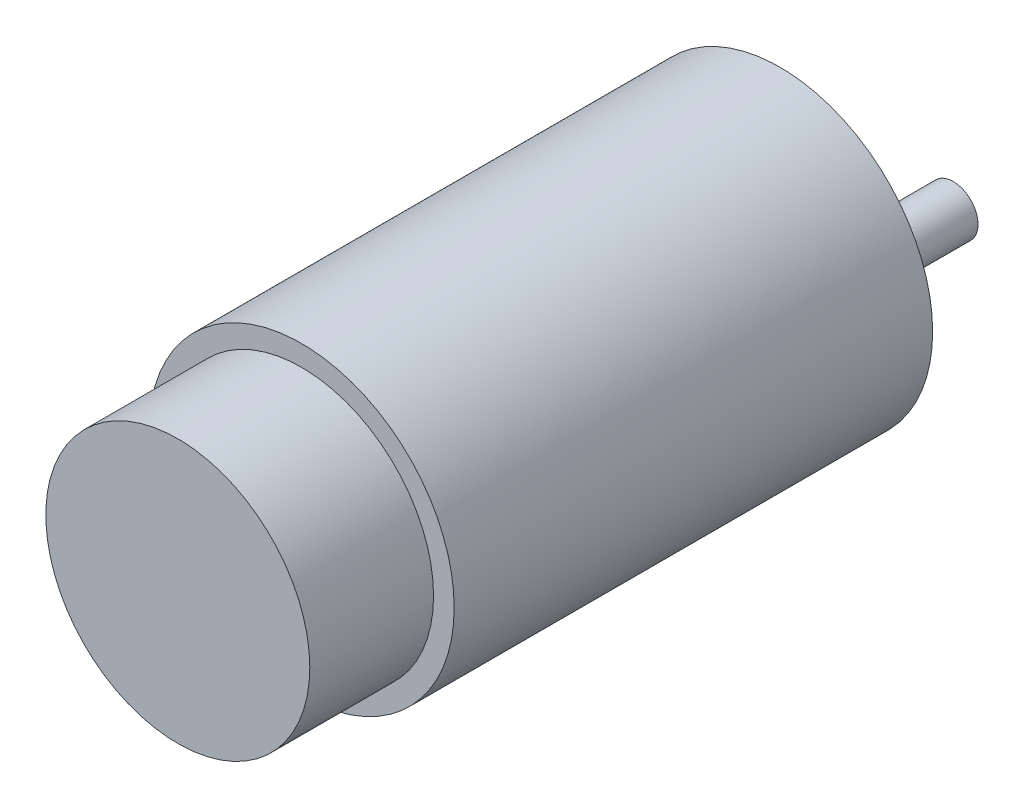
ISO-10303-21;
HEADER;
FILE_DESCRIPTION(('STEP AP214'),'2;1');
FILE_NAME('part.step','',(''),(''),'','','');
FILE_SCHEMA(('AUTOMOTIVE_DESIGN { 1 0 10303 214 1 1 1 1 }'));
ENDSEC;
DATA;
#1=APPLICATION_CONTEXT('core data for automotive mechanical design processes');
#2=APPLICATION_PROTOCOL_DEFINITION('international standard','automotive_design',2000,#1);
#3=PRODUCT_CONTEXT('',#1,'mechanical');
#4=PRODUCT('Part','Part','',(#3));
#5=PRODUCT_RELATED_PRODUCT_CATEGORY('part','',(#4));
#6=PRODUCT_DEFINITION_FORMATION('','',#4);
#7=PRODUCT_DEFINITION_CONTEXT('part definition',#1,'design');
#8=PRODUCT_DEFINITION('design','',#6,#7);
#9=PRODUCT_DEFINITION_SHAPE('','',#8);
#10=(LENGTH_UNIT() NAMED_UNIT(*) SI_UNIT(.MILLI.,.METRE.));
#11=(NAMED_UNIT(*) PLANE_ANGLE_UNIT() SI_UNIT($,.RADIAN.));
#12=(NAMED_UNIT(*) SI_UNIT($,.STERADIAN.) SOLID_ANGLE_UNIT());
#13=UNCERTAINTY_MEASURE_WITH_UNIT(LENGTH_MEASURE(1.E-05),#10,'distance_accuracy_value','');
#14=(GEOMETRIC_REPRESENTATION_CONTEXT(3) GLOBAL_UNCERTAINTY_ASSIGNED_CONTEXT((#13)) GLOBAL_UNIT_ASSIGNED_CONTEXT((#10,
#11,#12)) REPRESENTATION_CONTEXT('',''));
#15=CARTESIAN_POINT('',(0.,0.,0.));
#16=DIRECTION('',(0.,0.,1.));
#17=DIRECTION('',(1.,0.,0.));
#18=AXIS2_PLACEMENT_3D('',#15,#16,#17);
#19=CARTESIAN_POINT('',(0.,0.,73.));
#20=DIRECTION('',(0.,0.,-1.));
#21=DIRECTION('',(-1.,0.,0.));
#22=AXIS2_PLACEMENT_3D('',#19,#20,#21);
#23=CYLINDRICAL_SURFACE('',#22,16.);
#24=CARTESIAN_POINT('',(0.,0.,73.));
#25=DIRECTION('',(0.,0.,1.));
#26=DIRECTION('',(1.,0.,0.));
#27=AXIS2_PLACEMENT_3D('',#24,#25,#26);
#28=CIRCLE('',#27,16.);
#29=CARTESIAN_POINT('',(16.,0.,73.));
#30=VERTEX_POINT('',#29);
#31=EDGE_CURVE('E11',#30,#30,#28,.T.);
#32=ORIENTED_EDGE('',*,*,#31,.F.);
#33=EDGE_LOOP('',(#32));
#34=FACE_BOUND('',#33,.T.);
#35=CARTESIAN_POINT('',(0.,0.,58.));
#36=DIRECTION('',(0.,0.,1.));
#37=DIRECTION('',(1.,0.,0.));
#38=AXIS2_PLACEMENT_3D('',#35,#36,#37);
#39=CIRCLE('',#38,16.);
#40=CARTESIAN_POINT('',(16.,0.,58.));
#41=VERTEX_POINT('',#40);
#42=EDGE_CURVE('E52',#41,#41,#39,.T.);
#43=ORIENTED_EDGE('',*,*,#42,.T.);
#44=EDGE_LOOP('',(#43));
#45=FACE_BOUND('',#44,.T.);
#46=ADVANCED_FACE('F49',(#34,#45),#23,.T.);
#47=CARTESIAN_POINT('',(0.,0.,73.));
#48=DIRECTION('',(0.,0.,1.));
#49=DIRECTION('',(1.,0.,0.));
#50=AXIS2_PLACEMENT_3D('',#47,#48,#49);
#51=PLANE('',#50);
#52=ORIENTED_EDGE('',*,*,#31,.T.);
#53=EDGE_LOOP('',(#52));
#54=FACE_BOUND('',#53,.T.);
#55=ADVANCED_FACE('F64',(#54),#51,.T.);
#56=CARTESIAN_POINT('',(0.,0.,58.));
#57=DIRECTION('',(0.,0.,1.));
#58=DIRECTION('',(1.,0.,0.));
#59=AXIS2_PLACEMENT_3D('',#56,#57,#58);
#60=PLANE('',#59);
#61=ORIENTED_EDGE('',*,*,#42,.F.);
#62=EDGE_LOOP('',(#61));
#63=FACE_BOUND('',#62,.T.);
#64=ADVANCED_FACE('F62',(#63),#60,.F.);
#65=CLOSED_SHELL('',(#46,#55,#64));
#66=MANIFOLD_SOLID_BREP('B2',#65);
#67=CARTESIAN_POINT('',(0.,-7.,-6.));
#68=DIRECTION('',(0.,0.,-1.));
#69=DIRECTION('',(-1.,0.,0.));
#70=AXIS2_PLACEMENT_3D('',#67,#68,#69);
#71=PLANE('',#70);
#72=CARTESIAN_POINT('',(0.,-7.,-6.));
#73=DIRECTION('',(0.,0.,-1.));
#74=DIRECTION('',(-1.,0.,0.));
#75=AXIS2_PLACEMENT_3D('',#72,#73,#74);
#76=CIRCLE('',#75,6.);
#77=CARTESIAN_POINT('',(-6.,-7.,-6.));
#78=VERTEX_POINT('',#77);
#79=EDGE_CURVE('E137',#78,#78,#76,.T.);
#80=ORIENTED_EDGE('',*,*,#79,.T.);
#81=EDGE_LOOP('',(#80));
#82=FACE_BOUND('',#81,.T.);
#83=CARTESIAN_POINT('',(0.,-7.,-6.));
#84=DIRECTION('',(0.,0.,-1.));
#85=DIRECTION('',(-1.,0.,0.));
#86=AXIS2_PLACEMENT_3D('',#83,#84,#85);
#87=CIRCLE('',#86,3.);
#88=CARTESIAN_POINT('',(-3.,-7.,-6.));
#89=VERTEX_POINT('',#88);
#90=EDGE_CURVE('E125',#89,#89,#87,.T.);
#91=ORIENTED_EDGE('',*,*,#90,.F.);
#92=EDGE_LOOP('',(#91));
#93=FACE_BOUND('',#92,.T.);
#94=ADVANCED_FACE('F90',(#82,#93),#71,.T.);
#95=CARTESIAN_POINT('',(0.,-9.4,-50.0721744282442));
#96=DIRECTION('',(0.,-1.,0.));
#97=DIRECTION('',(0.,0.,-1.));
#98=AXIS2_PLACEMENT_3D('',#95,#96,#97);
#99=PLANE('',#98);
#100=DIRECTION('',(0.,0.,1.));
#101=VECTOR('',#100,1.);
#102=CARTESIAN_POINT('',(1.8,-9.4,-50.0721744282442));
#103=LINE('',#102,#101);
#104=CARTESIAN_POINT('',(1.8,-9.4,-21.));
#105=VERTEX_POINT('',#104);
#106=CARTESIAN_POINT('',(1.8,-9.4,-9.));
#107=VERTEX_POINT('',#106);
#108=EDGE_CURVE('E123',#105,#107,#103,.T.);
#109=ORIENTED_EDGE('',*,*,#108,.T.);
#110=DIRECTION('',(-1.,0.,0.));
#111=VECTOR('',#110,1.);
#112=CARTESIAN_POINT('',(0.,-9.4,-9.));
#113=LINE('',#112,#111);
#114=CARTESIAN_POINT('',(-1.8,-9.4,-9.));
#115=VERTEX_POINT('',#114);
#116=EDGE_CURVE('E47',#107,#115,#113,.T.);
#117=ORIENTED_EDGE('',*,*,#116,.T.);
#118=DIRECTION('',(0.,0.,1.));
#119=VECTOR('',#118,1.);
#120=CARTESIAN_POINT('',(-1.8,-9.4,-50.0721744282442));
#121=LINE('',#120,#119);
#122=CARTESIAN_POINT('',(-1.8,-9.4,-21.));
#123=VERTEX_POINT('',#122);
#124=EDGE_CURVE('E124',#123,#115,#121,.T.);
#125=ORIENTED_EDGE('',*,*,#124,.F.);
#126=DIRECTION('',(-1.,0.,0.));
#127=VECTOR('',#126,1.);
#128=CARTESIAN_POINT('',(0.,-9.4,-21.));
#129=LINE('',#128,#127);
#130=EDGE_CURVE('E129',#105,#123,#129,.T.);
#131=ORIENTED_EDGE('',*,*,#130,.F.);
#132=EDGE_LOOP('',(#109,#117,#125,#131));
#133=FACE_BOUND('',#132,.T.);
#134=ADVANCED_FACE('F128',(#133),#99,.T.);
#135=CARTESIAN_POINT('',(0.,0.,58.));
#136=DIRECTION('',(0.,0.,-1.));
#137=DIRECTION('',(-1.,0.,0.));
#138=AXIS2_PLACEMENT_3D('',#135,#136,#137);
#139=CYLINDRICAL_SURFACE('',#138,18.5);
#140=CARTESIAN_POINT('',(0.,0.,58.));
#141=DIRECTION('',(0.,0.,1.));
#142=DIRECTION('',(1.,0.,0.));
#143=AXIS2_PLACEMENT_3D('',#140,#141,#142);
#144=CIRCLE('',#143,18.5);
#145=CARTESIAN_POINT('',(-18.5,0.,58.));
#146=VERTEX_POINT('',#145);
#147=EDGE_CURVE('E141',#146,#146,#144,.T.);
#148=CARTESIAN_POINT('',(0.,0.,0.));
#149=DIRECTION('',(0.,0.,1.));
#150=DIRECTION('',(1.,0.,0.));
#151=AXIS2_PLACEMENT_3D('',#148,#149,#150);
#152=CIRCLE('',#151,18.5);
#153=CARTESIAN_POINT('',(-18.5,0.,0.));
#154=VERTEX_POINT('',#153);
#155=EDGE_CURVE('E140',#154,#154,#152,.T.);
#156=CARTESIAN_POINT('',(-18.5,0.,58.));
#157=CARTESIAN_POINT('',(-18.5,0.,57.3958333333333));
#158=CARTESIAN_POINT('',(-18.5,0.,56.7916666666667));
#159=CARTESIAN_POINT('',(-18.5,0.,55.5833333333333));
#160=CARTESIAN_POINT('',(-18.5,0.,54.9791666666667));
#161=CARTESIAN_POINT('',(-18.5,0.,53.7708333333333));
#162=CARTESIAN_POINT('',(-18.5,0.,53.1666666666667));
#163=CARTESIAN_POINT('',(-18.5,0.,51.9583333333333));
#164=CARTESIAN_POINT('',(-18.5,0.,51.3541666666667));
#165=CARTESIAN_POINT('',(-18.5,0.,50.1458333333333));
#166=CARTESIAN_POINT('',(-18.5,0.,49.5416666666667));
#167=CARTESIAN_POINT('',(-18.5,0.,48.3333333333333));
#168=CARTESIAN_POINT('',(-18.5,0.,47.7291666666667));
#169=CARTESIAN_POINT('',(-18.5,0.,46.5208333333333));
#170=CARTESIAN_POINT('',(-18.5,0.,45.9166666666667));
#171=CARTESIAN_POINT('',(-18.5,0.,44.7083333333333));
#172=CARTESIAN_POINT('',(-18.5,0.,44.1041666666667));
#173=CARTESIAN_POINT('',(-18.5,0.,42.8958333333333));
#174=CARTESIAN_POINT('',(-18.5,0.,42.2916666666667));
#175=CARTESIAN_POINT('',(-18.5,0.,41.0833333333333));
#176=CARTESIAN_POINT('',(-18.5,0.,40.4791666666667));
#177=CARTESIAN_POINT('',(-18.5,0.,39.2708333333333));
#178=CARTESIAN_POINT('',(-18.5,0.,38.6666666666667));
#179=CARTESIAN_POINT('',(-18.5,0.,37.4583333333333));
#180=CARTESIAN_POINT('',(-18.5,0.,36.8541666666667));
#181=CARTESIAN_POINT('',(-18.5,0.,35.6458333333333));
#182=CARTESIAN_POINT('',(-18.5,0.,35.0416666666667));
#183=CARTESIAN_POINT('',(-18.5,0.,33.8333333333333));
#184=CARTESIAN_POINT('',(-18.5,0.,33.2291666666667));
#185=CARTESIAN_POINT('',(-18.5,0.,32.0208333333333));
#186=CARTESIAN_POINT('',(-18.5,0.,31.4166666666667));
#187=CARTESIAN_POINT('',(-18.5,0.,30.2083333333333));
#188=CARTESIAN_POINT('',(-18.5,0.,29.6041666666667));
#189=CARTESIAN_POINT('',(-18.5,0.,28.3958333333333));
#190=CARTESIAN_POINT('',(-18.5,0.,27.7916666666667));
#191=CARTESIAN_POINT('',(-18.5,0.,26.5833333333333));
#192=CARTESIAN_POINT('',(-18.5,0.,25.9791666666667));
#193=CARTESIAN_POINT('',(-18.5,0.,24.7708333333333));
#194=CARTESIAN_POINT('',(-18.5,0.,24.1666666666667));
#195=CARTESIAN_POINT('',(-18.5,0.,22.9583333333333));
#196=CARTESIAN_POINT('',(-18.5,0.,22.3541666666667));
#197=CARTESIAN_POINT('',(-18.5,0.,21.1458333333333));
#198=CARTESIAN_POINT('',(-18.5,0.,20.5416666666667));
#199=CARTESIAN_POINT('',(-18.5,0.,19.3333333333333));
#200=CARTESIAN_POINT('',(-18.5,0.,18.7291666666667));
#201=CARTESIAN_POINT('',(-18.5,0.,17.5208333333333));
#202=CARTESIAN_POINT('',(-18.5,0.,16.9166666666667));
#203=CARTESIAN_POINT('',(-18.5,0.,15.7083333333333));
#204=CARTESIAN_POINT('',(-18.5,0.,15.1041666666667));
#205=CARTESIAN_POINT('',(-18.5,0.,13.8958333333333));
#206=CARTESIAN_POINT('',(-18.5,0.,13.2916666666667));
#207=CARTESIAN_POINT('',(-18.5,0.,12.0833333333333));
#208=CARTESIAN_POINT('',(-18.5,0.,11.4791666666667));
#209=CARTESIAN_POINT('',(-18.5,0.,10.2708333333333));
#210=CARTESIAN_POINT('',(-18.5,0.,9.66666666666667));
#211=CARTESIAN_POINT('',(-18.5,0.,8.45833333333333));
#212=CARTESIAN_POINT('',(-18.5,0.,7.85416666666667));
#213=CARTESIAN_POINT('',(-18.5,0.,6.64583333333333));
#214=CARTESIAN_POINT('',(-18.5,0.,6.04166666666667));
#215=CARTESIAN_POINT('',(-18.5,0.,4.83333333333333));
#216=CARTESIAN_POINT('',(-18.5,0.,4.22916666666667));
#217=CARTESIAN_POINT('',(-18.5,0.,3.02083333333334));
#218=CARTESIAN_POINT('',(-18.5,0.,2.41666666666667));
#219=CARTESIAN_POINT('',(-18.5,0.,1.20833333333333));
#220=CARTESIAN_POINT('',(-18.5,0.,0.604166666666666));
#221=CARTESIAN_POINT('',(-18.5,0.,0.));
#222=B_SPLINE_CURVE_WITH_KNOTS('',3,(#156,#157,#158,#159,#160,#161,#162,#163,#164,#165,#166,
#167,#168,#169,#170,#171,#172,#173,#174,#175,#176,#177,#178,#179,#180,#181,#182,#183,#184,#185,
#186,#187,#188,#189,#190,#191,#192,#193,#194,#195,#196,#197,#198,#199,#200,#201,#202,#203,#204,
#205,#206,#207,#208,#209,#210,#211,#212,#213,#214,#215,#216,#217,#218,#219,#220,#221),
.UNSPECIFIED.,.F.,.F.,(4,2,2,2,2,2,2,2,2,2,2,2,2,2,2,2,2,2,2,2,2,2,2,2,2,2,2,2,2,2,2,2,4),(0.,
1.8125,3.625,5.4375,7.25000000000001,9.0625,10.875,12.6875,14.5,16.3125,18.125,19.9375,21.75,
23.5625,25.375,27.1875,29.,30.8125,32.625,34.4375,36.25,38.0625,39.875,41.6875,43.5,45.3125,
47.125,48.9375,50.75,52.5625,54.375,56.1875,58.),.UNSPECIFIED.);
#223=EDGE_CURVE('BSEAM92',#146,#154,#222,.T.);
#224=ORIENTED_EDGE('',*,*,#147,.F.);
#225=ORIENTED_EDGE('',*,*,#155,.T.);
#226=ORIENTED_EDGE('',*,*,#223,.T.);
#227=ORIENTED_EDGE('',*,*,#223,.F.);
#228=EDGE_LOOP('',(#224,#226,#225,#227));
#229=FACE_BOUND('',#228,.T.);
#230=ADVANCED_FACE('F92',(#229),#139,.T.);
#231=CARTESIAN_POINT('',(0.,0.,58.));
#232=DIRECTION('',(0.,0.,1.));
#233=DIRECTION('',(1.,0.,0.));
#234=AXIS2_PLACEMENT_3D('',#231,#232,#233);
#235=PLANE('',#234);
#236=ORIENTED_EDGE('',*,*,#147,.T.);
#237=EDGE_LOOP('',(#236));
#238=FACE_BOUND('',#237,.T.);
#239=ADVANCED_FACE('F153',(#238),#235,.T.);
#240=CARTESIAN_POINT('',(0.,0.,0.));
#241=DIRECTION('',(0.,0.,1.));
#242=DIRECTION('',(1.,0.,0.));
#243=AXIS2_PLACEMENT_3D('',#240,#241,#242);
#244=PLANE('',#243);
#245=CARTESIAN_POINT('',(-7.74999999999993,-13.4233937586588,0.));
#246=DIRECTION('',(0.,0.,-1.));
#247=DIRECTION('',(-1.,0.,0.));
#248=AXIS2_PLACEMENT_3D('',#245,#246,#247);
#249=CIRCLE('',#248,1.6);
#250=CARTESIAN_POINT('',(-9.34999999999993,-13.4233937586588,0.));
#251=VERTEX_POINT('',#250);
#252=EDGE_CURVE('E272',#251,#251,#249,.T.);
#253=ORIENTED_EDGE('',*,*,#252,.F.);
#254=EDGE_LOOP('',(#253));
#255=FACE_BOUND('',#254,.T.);
#256=CARTESIAN_POINT('',(-15.5,0.,0.));
#257=DIRECTION('',(0.,0.,-1.));
#258=DIRECTION('',(-1.,0.,0.));
#259=AXIS2_PLACEMENT_3D('',#256,#257,#258);
#260=CIRCLE('',#259,1.6);
#261=CARTESIAN_POINT('',(-17.1,0.,0.));
#262=VERTEX_POINT('',#261);
#263=EDGE_CURVE('E266',#262,#262,#260,.T.);
#264=ORIENTED_EDGE('',*,*,#263,.F.);
#265=EDGE_LOOP('',(#264));
#266=FACE_BOUND('',#265,.T.);
#267=CARTESIAN_POINT('',(-7.75000000000001,13.4233937586588,0.));
#268=DIRECTION('',(0.,0.,-1.));
#269=DIRECTION('',(-1.,0.,0.));
#270=AXIS2_PLACEMENT_3D('',#267,#268,#269);
#271=CIRCLE('',#270,1.6);
#272=CARTESIAN_POINT('',(-9.35000000000001,13.4233937586588,0.));
#273=VERTEX_POINT('',#272);
#274=EDGE_CURVE('E260',#273,#273,#271,.T.);
#275=ORIENTED_EDGE('',*,*,#274,.F.);
#276=EDGE_LOOP('',(#275));
#277=FACE_BOUND('',#276,.T.);
#278=CARTESIAN_POINT('',(7.75000000000002,13.4233937586588,0.));
#279=DIRECTION('',(0.,0.,-1.));
#280=DIRECTION('',(-1.,0.,0.));
#281=AXIS2_PLACEMENT_3D('',#278,#279,#280);
#282=CIRCLE('',#281,1.6);
#283=CARTESIAN_POINT('',(6.15000000000002,13.4233937586588,0.));
#284=VERTEX_POINT('',#283);
#285=EDGE_CURVE('E254',#284,#284,#282,.T.);
#286=ORIENTED_EDGE('',*,*,#285,.F.);
#287=EDGE_LOOP('',(#286));
#288=FACE_BOUND('',#287,.T.);
#289=CARTESIAN_POINT('',(15.5,0.,0.));
#290=DIRECTION('',(0.,0.,-1.));
#291=DIRECTION('',(-1.,0.,0.));
#292=AXIS2_PLACEMENT_3D('',#289,#290,#291);
#293=CIRCLE('',#292,1.6);
#294=CARTESIAN_POINT('',(13.9,0.,0.));
#295=VERTEX_POINT('',#294);
#296=EDGE_CURVE('E244',#295,#295,#293,.T.);
#297=ORIENTED_EDGE('',*,*,#296,.F.);
#298=EDGE_LOOP('',(#297));
#299=FACE_BOUND('',#298,.T.);
#300=CARTESIAN_POINT('',(7.74999999999988,-13.4233937586589,0.));
#301=DIRECTION('',(0.,0.,-1.));
#302=DIRECTION('',(-1.,0.,0.));
#303=AXIS2_PLACEMENT_3D('',#300,#301,#302);
#304=CIRCLE('',#303,1.59999999999997);
#305=CARTESIAN_POINT('',(6.14999999999991,-13.4233937586589,0.));
#306=VERTEX_POINT('',#305);
#307=EDGE_CURVE('E243',#306,#306,#304,.T.);
#308=ORIENTED_EDGE('',*,*,#307,.F.);
#309=EDGE_LOOP('',(#308));
#310=FACE_BOUND('',#309,.T.);
#311=CARTESIAN_POINT('',(0.,-7.,0.));
#312=DIRECTION('',(0.,0.,1.));
#313=DIRECTION('',(1.,0.,0.));
#314=AXIS2_PLACEMENT_3D('',#311,#312,#313);
#315=CIRCLE('',#314,6.);
#316=CARTESIAN_POINT('',(6.,-7.,0.));
#317=VERTEX_POINT('',#316);
#318=EDGE_CURVE('E98',#317,#317,#315,.F.);
#319=ORIENTED_EDGE('',*,*,#318,.F.);
#320=EDGE_LOOP('',(#319));
#321=FACE_BOUND('',#320,.T.);
#322=ORIENTED_EDGE('',*,*,#155,.F.);
#323=EDGE_LOOP('',(#322));
#324=FACE_BOUND('',#323,.T.);
#325=ADVANCED_FACE('F150',(#255,#266,#277,#288,#299,#310,#321,#324),#244,.F.);
#326=CARTESIAN_POINT('',(0.,-7.,-6.));
#327=DIRECTION('',(0.,0.,1.));
#328=DIRECTION('',(1.,0.,0.));
#329=AXIS2_PLACEMENT_3D('',#326,#327,#328);
#330=CYLINDRICAL_SURFACE('',#329,6.);
#331=ORIENTED_EDGE('',*,*,#79,.F.);
#332=EDGE_LOOP('',(#331));
#333=FACE_BOUND('',#332,.T.);
#334=ORIENTED_EDGE('',*,*,#318,.T.);
#335=EDGE_LOOP('',(#334));
#336=FACE_BOUND('',#335,.T.);
#337=ADVANCED_FACE('F148',(#333,#336),#330,.T.);
#338=CARTESIAN_POINT('',(0.,-7.,-50.0721744282442));
#339=DIRECTION('',(0.,0.,1.));
#340=DIRECTION('',(1.,0.,0.));
#341=AXIS2_PLACEMENT_3D('',#338,#339,#340);
#342=CYLINDRICAL_SURFACE('',#341,3.);
#343=ORIENTED_EDGE('',*,*,#90,.T.);
#344=EDGE_LOOP('',(#343));
#345=FACE_BOUND('',#344,.T.);
#346=CARTESIAN_POINT('',(0.,-7.,-9.));
#347=DIRECTION('',(0.,0.,1.));
#348=DIRECTION('',(1.,0.,0.));
#349=AXIS2_PLACEMENT_3D('',#346,#347,#348);
#350=CIRCLE('',#349,3.);
#351=EDGE_CURVE('E104',#115,#107,#350,.T.);
#352=ORIENTED_EDGE('',*,*,#351,.T.);
#353=ORIENTED_EDGE('',*,*,#108,.F.);
#354=CARTESIAN_POINT('',(0.,-7.,-21.));
#355=DIRECTION('',(0.,0.,1.));
#356=DIRECTION('',(1.,0.,0.));
#357=AXIS2_PLACEMENT_3D('',#354,#355,#356);
#358=CIRCLE('',#357,3.);
#359=EDGE_CURVE('E110',#105,#123,#358,.T.);
#360=ORIENTED_EDGE('',*,*,#359,.T.);
#361=ORIENTED_EDGE('',*,*,#124,.T.);
#362=EDGE_LOOP('',(#352,#353,#360,#361));
#363=FACE_BOUND('',#362,.T.);
#364=ADVANCED_FACE('F122',(#345,#363),#342,.T.);
#365=CARTESIAN_POINT('',(0.,0.,-21.));
#366=DIRECTION('',(0.,0.,1.));
#367=DIRECTION('',(1.,0.,0.));
#368=AXIS2_PLACEMENT_3D('',#365,#366,#367);
#369=PLANE('',#368);
#370=ORIENTED_EDGE('',*,*,#130,.T.);
#371=ORIENTED_EDGE('',*,*,#359,.F.);
#372=EDGE_LOOP('',(#370,#371));
#373=FACE_BOUND('',#372,.T.);
#374=ADVANCED_FACE('F181',(#373),#369,.F.);
#375=CARTESIAN_POINT('',(0.,0.,-9.));
#376=DIRECTION('',(0.,0.,1.));
#377=DIRECTION('',(1.,0.,0.));
#378=AXIS2_PLACEMENT_3D('',#375,#376,#377);
#379=PLANE('',#378);
#380=ORIENTED_EDGE('',*,*,#116,.F.);
#381=ORIENTED_EDGE('',*,*,#351,.F.);
#382=EDGE_LOOP('',(#380,#381));
#383=FACE_BOUND('',#382,.T.);
#384=ADVANCED_FACE('F115',(#383),#379,.F.);
#385=CARTESIAN_POINT('',(7.74999999999988,-13.4233937586589,5.));
#386=DIRECTION('',(0.,0.,-1.));
#387=DIRECTION('',(-1.,0.,0.));
#388=AXIS2_PLACEMENT_3D('',#385,#386,#387);
#389=CYLINDRICAL_SURFACE('',#388,1.59999999999997);
#390=CARTESIAN_POINT('',(7.74999999999988,-13.4233937586589,5.));
#391=DIRECTION('',(0.,0.,-1.));
#392=DIRECTION('',(-1.,0.,0.));
#393=AXIS2_PLACEMENT_3D('',#390,#391,#392);
#394=CIRCLE('',#393,1.59999999999997);
#395=CARTESIAN_POINT('',(6.14999999999991,-13.4233937586589,5.));
#396=VERTEX_POINT('',#395);
#397=EDGE_CURVE('E126',#396,#396,#394,.T.);
#398=ORIENTED_EDGE('',*,*,#397,.F.);
#399=EDGE_LOOP('',(#398));
#400=FACE_BOUND('',#399,.T.);
#401=ORIENTED_EDGE('',*,*,#307,.T.);
#402=EDGE_LOOP('',(#401));
#403=FACE_BOUND('',#402,.T.);
#404=ADVANCED_FACE('F191',(#400,#403),#389,.F.);
#405=CARTESIAN_POINT('',(7.74999999999988,-13.4233937586589,5.));
#406=DIRECTION('',(0.,0.,-1.));
#407=DIRECTION('',(-1.,0.,0.));
#408=AXIS2_PLACEMENT_3D('',#405,#406,#407);
#409=PLANE('',#408);
#410=ORIENTED_EDGE('',*,*,#397,.T.);
#411=EDGE_LOOP('',(#410));
#412=FACE_BOUND('',#411,.T.);
#413=ADVANCED_FACE('F194',(#412),#409,.T.);
#414=CARTESIAN_POINT('',(15.5,0.,5.));
#415=DIRECTION('',(0.,0.,-1.));
#416=DIRECTION('',(-1.,0.,0.));
#417=AXIS2_PLACEMENT_3D('',#414,#415,#416);
#418=CYLINDRICAL_SURFACE('',#417,1.6);
#419=CARTESIAN_POINT('',(15.5,0.,5.));
#420=DIRECTION('',(0.,0.,-1.));
#421=DIRECTION('',(-1.,0.,0.));
#422=AXIS2_PLACEMENT_3D('',#419,#420,#421);
#423=CIRCLE('',#422,1.6);
#424=CARTESIAN_POINT('',(13.9,0.,5.));
#425=VERTEX_POINT('',#424);
#426=EDGE_CURVE('E242',#425,#425,#423,.T.);
#427=ORIENTED_EDGE('',*,*,#426,.F.);
#428=EDGE_LOOP('',(#427));
#429=FACE_BOUND('',#428,.T.);
#430=ORIENTED_EDGE('',*,*,#296,.T.);
#431=EDGE_LOOP('',(#430));
#432=FACE_BOUND('',#431,.T.);
#433=ADVANCED_FACE('F198',(#429,#432),#418,.F.);
#434=CARTESIAN_POINT('',(15.5,0.,5.));
#435=DIRECTION('',(0.,0.,-1.));
#436=DIRECTION('',(-1.,0.,0.));
#437=AXIS2_PLACEMENT_3D('',#434,#435,#436);
#438=PLANE('',#437);
#439=ORIENTED_EDGE('',*,*,#426,.T.);
#440=EDGE_LOOP('',(#439));
#441=FACE_BOUND('',#440,.T.);
#442=ADVANCED_FACE('F228',(#441),#438,.T.);
#443=CARTESIAN_POINT('',(7.75000000000002,13.4233937586588,5.));
#444=DIRECTION('',(0.,0.,-1.));
#445=DIRECTION('',(-1.,0.,0.));
#446=AXIS2_PLACEMENT_3D('',#443,#444,#445);
#447=CYLINDRICAL_SURFACE('',#446,1.6);
#448=CARTESIAN_POINT('',(7.75000000000002,13.4233937586588,5.));
#449=DIRECTION('',(0.,0.,-1.));
#450=DIRECTION('',(-1.,0.,0.));
#451=AXIS2_PLACEMENT_3D('',#448,#449,#450);
#452=CIRCLE('',#451,1.6);
#453=CARTESIAN_POINT('',(6.15000000000002,13.4233937586588,5.));
#454=VERTEX_POINT('',#453);
#455=EDGE_CURVE('E249',#454,#454,#452,.T.);
#456=ORIENTED_EDGE('',*,*,#455,.F.);
#457=EDGE_LOOP('',(#456));
#458=FACE_BOUND('',#457,.T.);
#459=ORIENTED_EDGE('',*,*,#285,.T.);
#460=EDGE_LOOP('',(#459));
#461=FACE_BOUND('',#460,.T.);
#462=ADVANCED_FACE('F225',(#458,#461),#447,.F.);
#463=CARTESIAN_POINT('',(7.75000000000002,13.4233937586588,5.));
#464=DIRECTION('',(0.,0.,-1.));
#465=DIRECTION('',(-1.,0.,0.));
#466=AXIS2_PLACEMENT_3D('',#463,#464,#465);
#467=PLANE('',#466);
#468=ORIENTED_EDGE('',*,*,#455,.T.);
#469=EDGE_LOOP('',(#468));
#470=FACE_BOUND('',#469,.T.);
#471=ADVANCED_FACE('F220',(#470),#467,.T.);
#472=CARTESIAN_POINT('',(-7.75000000000001,13.4233937586588,5.));
#473=DIRECTION('',(0.,0.,-1.));
#474=DIRECTION('',(-1.,0.,0.));
#475=AXIS2_PLACEMENT_3D('',#472,#473,#474);
#476=CYLINDRICAL_SURFACE('',#475,1.6);
#477=CARTESIAN_POINT('',(-7.75000000000001,13.4233937586588,5.));
#478=DIRECTION('',(0.,0.,-1.));
#479=DIRECTION('',(-1.,0.,0.));
#480=AXIS2_PLACEMENT_3D('',#477,#478,#479);
#481=CIRCLE('',#480,1.6);
#482=CARTESIAN_POINT('',(-9.35000000000001,13.4233937586588,5.));
#483=VERTEX_POINT('',#482);
#484=EDGE_CURVE('E257',#483,#483,#481,.T.);
#485=ORIENTED_EDGE('',*,*,#484,.F.);
#486=EDGE_LOOP('',(#485));
#487=FACE_BOUND('',#486,.T.);
#488=ORIENTED_EDGE('',*,*,#274,.T.);
#489=EDGE_LOOP('',(#488));
#490=FACE_BOUND('',#489,.T.);
#491=ADVANCED_FACE('F217',(#487,#490),#476,.F.);
#492=CARTESIAN_POINT('',(-7.75000000000001,13.4233937586588,5.));
#493=DIRECTION('',(0.,0.,-1.));
#494=DIRECTION('',(-1.,0.,0.));
#495=AXIS2_PLACEMENT_3D('',#492,#493,#494);
#496=PLANE('',#495);
#497=ORIENTED_EDGE('',*,*,#484,.T.);
#498=EDGE_LOOP('',(#497));
#499=FACE_BOUND('',#498,.T.);
#500=ADVANCED_FACE('F212',(#499),#496,.T.);
#501=CARTESIAN_POINT('',(-15.5,0.,5.));
#502=DIRECTION('',(0.,0.,-1.));
#503=DIRECTION('',(-1.,0.,0.));
#504=AXIS2_PLACEMENT_3D('',#501,#502,#503);
#505=CYLINDRICAL_SURFACE('',#504,1.6);
#506=CARTESIAN_POINT('',(-15.5,0.,5.));
#507=DIRECTION('',(0.,0.,-1.));
#508=DIRECTION('',(-1.,0.,0.));
#509=AXIS2_PLACEMENT_3D('',#506,#507,#508);
#510=CIRCLE('',#509,1.6);
#511=CARTESIAN_POINT('',(-17.1,0.,5.));
#512=VERTEX_POINT('',#511);
#513=EDGE_CURVE('E263',#512,#512,#510,.T.);
#514=ORIENTED_EDGE('',*,*,#513,.F.);
#515=EDGE_LOOP('',(#514));
#516=FACE_BOUND('',#515,.T.);
#517=ORIENTED_EDGE('',*,*,#263,.T.);
#518=EDGE_LOOP('',(#517));
#519=FACE_BOUND('',#518,.T.);
#520=ADVANCED_FACE('F209',(#516,#519),#505,.F.);
#521=CARTESIAN_POINT('',(-15.5,0.,5.));
#522=DIRECTION('',(0.,0.,-1.));
#523=DIRECTION('',(-1.,0.,0.));
#524=AXIS2_PLACEMENT_3D('',#521,#522,#523);
#525=PLANE('',#524);
#526=ORIENTED_EDGE('',*,*,#513,.T.);
#527=EDGE_LOOP('',(#526));
#528=FACE_BOUND('',#527,.T.);
#529=ADVANCED_FACE('F204',(#528),#525,.T.);
#530=CARTESIAN_POINT('',(-7.74999999999993,-13.4233937586588,5.));
#531=DIRECTION('',(0.,0.,-1.));
#532=DIRECTION('',(-1.,0.,0.));
#533=AXIS2_PLACEMENT_3D('',#530,#531,#532);
#534=CYLINDRICAL_SURFACE('',#533,1.6);
#535=CARTESIAN_POINT('',(-7.74999999999993,-13.4233937586588,5.));
#536=DIRECTION('',(0.,0.,-1.));
#537=DIRECTION('',(-1.,0.,0.));
#538=AXIS2_PLACEMENT_3D('',#535,#536,#537);
#539=CIRCLE('',#538,1.6);
#540=CARTESIAN_POINT('',(-9.34999999999993,-13.4233937586588,5.));
#541=VERTEX_POINT('',#540);
#542=EDGE_CURVE('E269',#541,#541,#539,.T.);
#543=ORIENTED_EDGE('',*,*,#542,.F.);
#544=EDGE_LOOP('',(#543));
#545=FACE_BOUND('',#544,.T.);
#546=ORIENTED_EDGE('',*,*,#252,.T.);
#547=EDGE_LOOP('',(#546));
#548=FACE_BOUND('',#547,.T.);
#549=ADVANCED_FACE('F200',(#545,#548),#534,.F.);
#550=CARTESIAN_POINT('',(-7.74999999999993,-13.4233937586588,5.));
#551=DIRECTION('',(0.,0.,-1.));
#552=DIRECTION('',(-1.,0.,0.));
#553=AXIS2_PLACEMENT_3D('',#550,#551,#552);
#554=PLANE('',#553);
#555=ORIENTED_EDGE('',*,*,#542,.T.);
#556=EDGE_LOOP('',(#555));
#557=FACE_BOUND('',#556,.T.);
#558=ADVANCED_FACE('F203',(#557),#554,.T.);
#559=CLOSED_SHELL('',(#94,#134,#230,#239,#325,#337,#364,#374,#384,#404,#413,#433,#442,#462,#471,
#491,#500,#520,#529,#549,#558));
#560=MANIFOLD_SOLID_BREP('B6',#559);
#561=ADVANCED_BREP_SHAPE_REPRESENTATION('',(#18,#66,#560),#14);
#562=SHAPE_DEFINITION_REPRESENTATION(#9,#561);
ENDSEC;
END-ISO-10303-21;
